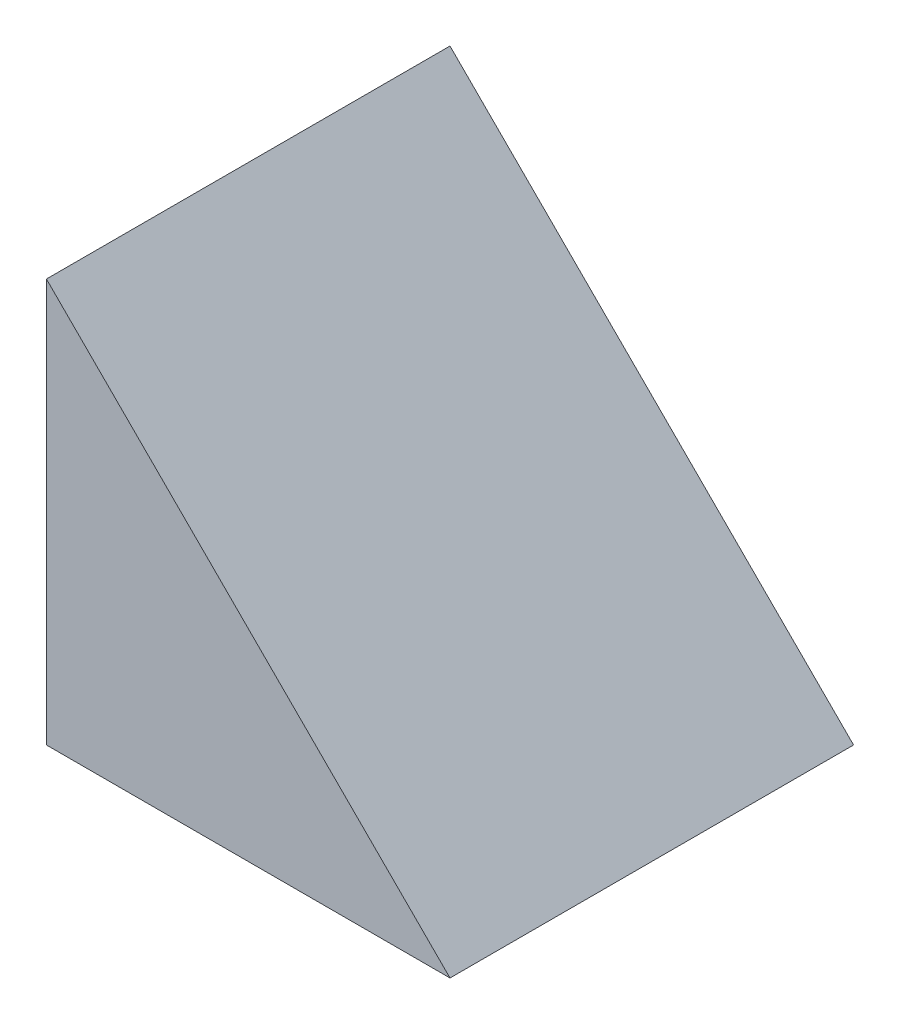
ISO-10303-21;
HEADER;
FILE_DESCRIPTION(('STEP AP214'),'2;1');
FILE_NAME('part.step','',(''),(''),'','','');
FILE_SCHEMA(('AUTOMOTIVE_DESIGN { 1 0 10303 214 1 1 1 1 }'));
ENDSEC;
DATA;
#1=APPLICATION_CONTEXT('core data for automotive mechanical design processes');
#2=APPLICATION_PROTOCOL_DEFINITION('international standard','automotive_design',2000,#1);
#3=PRODUCT_CONTEXT('',#1,'mechanical');
#4=PRODUCT('Part','Part','',(#3));
#5=PRODUCT_RELATED_PRODUCT_CATEGORY('part','',(#4));
#6=PRODUCT_DEFINITION_FORMATION('','',#4);
#7=PRODUCT_DEFINITION_CONTEXT('part definition',#1,'design');
#8=PRODUCT_DEFINITION('design','',#6,#7);
#9=PRODUCT_DEFINITION_SHAPE('','',#8);
#10=(LENGTH_UNIT() NAMED_UNIT(*) SI_UNIT(.MILLI.,.METRE.));
#11=(NAMED_UNIT(*) PLANE_ANGLE_UNIT() SI_UNIT($,.RADIAN.));
#12=(NAMED_UNIT(*) SI_UNIT($,.STERADIAN.) SOLID_ANGLE_UNIT());
#13=UNCERTAINTY_MEASURE_WITH_UNIT(LENGTH_MEASURE(1.E-05),#10,'distance_accuracy_value','');
#14=(GEOMETRIC_REPRESENTATION_CONTEXT(3) GLOBAL_UNCERTAINTY_ASSIGNED_CONTEXT((#13)) GLOBAL_UNIT_ASSIGNED_CONTEXT((#10,
#11,#12)) REPRESENTATION_CONTEXT('',''));
#15=CARTESIAN_POINT('',(0.,0.,0.));
#16=DIRECTION('',(0.,0.,1.));
#17=DIRECTION('',(1.,0.,0.));
#18=AXIS2_PLACEMENT_3D('',#15,#16,#17);
#19=CARTESIAN_POINT('',(30.,0.,30.));
#20=DIRECTION('',(0.,1.,0.));
#21=DIRECTION('',(-1.,0.,0.));
#22=AXIS2_PLACEMENT_3D('',#19,#20,#21);
#23=PLANE('',#22);
#24=DIRECTION('',(1.,0.,0.));
#25=VECTOR('',#24,1.);
#26=CARTESIAN_POINT('',(30.,0.,0.));
#27=LINE('',#26,#25);
#28=CARTESIAN_POINT('',(0.,0.,0.));
#29=VERTEX_POINT('',#28);
#30=CARTESIAN_POINT('',(30.,0.,0.));
#31=VERTEX_POINT('',#30);
#32=EDGE_CURVE('E80',#29,#31,#27,.T.);
#33=ORIENTED_EDGE('',*,*,#32,.T.);
#34=DIRECTION('',(0.,0.,-1.));
#35=VECTOR('',#34,1.);
#36=CARTESIAN_POINT('',(30.,0.,30.));
#37=LINE('',#36,#35);
#38=CARTESIAN_POINT('',(30.,0.,30.));
#39=VERTEX_POINT('',#38);
#40=EDGE_CURVE('E11',#39,#31,#37,.T.);
#41=ORIENTED_EDGE('',*,*,#40,.F.);
#42=DIRECTION('',(1.,0.,0.));
#43=VECTOR('',#42,1.);
#44=CARTESIAN_POINT('',(30.,0.,30.));
#45=LINE('',#44,#43);
#46=CARTESIAN_POINT('',(0.,0.,30.));
#47=VERTEX_POINT('',#46);
#48=EDGE_CURVE('E73',#47,#39,#45,.T.);
#49=ORIENTED_EDGE('',*,*,#48,.F.);
#50=DIRECTION('',(0.,0.,-1.));
#51=VECTOR('',#50,1.);
#52=CARTESIAN_POINT('',(0.,0.,30.));
#53=LINE('',#52,#51);
#54=EDGE_CURVE('E81',#47,#29,#53,.T.);
#55=ORIENTED_EDGE('',*,*,#54,.T.);
#56=EDGE_LOOP('',(#33,#41,#49,#55));
#57=FACE_BOUND('',#56,.T.);
#58=ADVANCED_FACE('F33',(#57),#23,.F.);
#59=CARTESIAN_POINT('',(0.,30.,30.));
#60=DIRECTION('',(-0.707106781186547,-0.707106781186547,0.));
#61=DIRECTION('',(0.707106781186548,-0.707106781186548,0.));
#62=AXIS2_PLACEMENT_3D('',#59,#60,#61);
#63=PLANE('',#62);
#64=DIRECTION('',(-0.707106781186547,0.707106781186547,0.));
#65=VECTOR('',#64,1.);
#66=CARTESIAN_POINT('',(0.,30.,0.));
#67=LINE('',#66,#65);
#68=CARTESIAN_POINT('',(0.,30.,0.));
#69=VERTEX_POINT('',#68);
#70=EDGE_CURVE('E61',#31,#69,#67,.T.);
#71=ORIENTED_EDGE('',*,*,#70,.T.);
#72=DIRECTION('',(0.,0.,-1.));
#73=VECTOR('',#72,1.);
#74=CARTESIAN_POINT('',(0.,30.,30.));
#75=LINE('',#74,#73);
#76=CARTESIAN_POINT('',(0.,30.,30.));
#77=VERTEX_POINT('',#76);
#78=EDGE_CURVE('E41',#77,#69,#75,.T.);
#79=ORIENTED_EDGE('',*,*,#78,.F.);
#80=DIRECTION('',(-0.707106781186547,0.707106781186547,0.));
#81=VECTOR('',#80,1.);
#82=CARTESIAN_POINT('',(0.,30.,30.));
#83=LINE('',#82,#81);
#84=EDGE_CURVE('E69',#39,#77,#83,.T.);
#85=ORIENTED_EDGE('',*,*,#84,.F.);
#86=ORIENTED_EDGE('',*,*,#40,.T.);
#87=EDGE_LOOP('',(#71,#79,#85,#86));
#88=FACE_BOUND('',#87,.T.);
#89=ADVANCED_FACE('F70',(#88),#63,.F.);
#90=CARTESIAN_POINT('',(0.,0.,30.));
#91=DIRECTION('',(1.,0.,0.));
#92=DIRECTION('',(0.,0.,-1.));
#93=AXIS2_PLACEMENT_3D('',#90,#91,#92);
#94=PLANE('',#93);
#95=DIRECTION('',(0.,-1.,0.));
#96=VECTOR('',#95,1.);
#97=CARTESIAN_POINT('',(0.,0.,0.));
#98=LINE('',#97,#96);
#99=EDGE_CURVE('E66',#69,#29,#98,.T.);
#100=ORIENTED_EDGE('',*,*,#99,.T.);
#101=ORIENTED_EDGE('',*,*,#54,.F.);
#102=DIRECTION('',(0.,-1.,0.));
#103=VECTOR('',#102,1.);
#104=CARTESIAN_POINT('',(0.,0.,30.));
#105=LINE('',#104,#103);
#106=EDGE_CURVE('E49',#77,#47,#105,.T.);
#107=ORIENTED_EDGE('',*,*,#106,.F.);
#108=ORIENTED_EDGE('',*,*,#78,.T.);
#109=EDGE_LOOP('',(#100,#101,#107,#108));
#110=FACE_BOUND('',#109,.T.);
#111=ADVANCED_FACE('F88',(#110),#94,.F.);
#112=CARTESIAN_POINT('',(0.,0.,30.));
#113=DIRECTION('',(0.,0.,-1.));
#114=DIRECTION('',(-1.,0.,0.));
#115=AXIS2_PLACEMENT_3D('',#112,#113,#114);
#116=PLANE('',#115);
#117=ORIENTED_EDGE('',*,*,#48,.T.);
#118=ORIENTED_EDGE('',*,*,#84,.T.);
#119=ORIENTED_EDGE('',*,*,#106,.T.);
#120=EDGE_LOOP('',(#117,#118,#119));
#121=FACE_BOUND('',#120,.T.);
#122=ADVANCED_FACE('F76',(#121),#116,.F.);
#123=CARTESIAN_POINT('',(0.,0.,0.));
#124=DIRECTION('',(0.,0.,-1.));
#125=DIRECTION('',(-1.,0.,0.));
#126=AXIS2_PLACEMENT_3D('',#123,#124,#125);
#127=PLANE('',#126);
#128=ORIENTED_EDGE('',*,*,#32,.F.);
#129=ORIENTED_EDGE('',*,*,#99,.F.);
#130=ORIENTED_EDGE('',*,*,#70,.F.);
#131=EDGE_LOOP('',(#128,#129,#130));
#132=FACE_BOUND('',#131,.T.);
#133=ADVANCED_FACE('F89',(#132),#127,.T.);
#134=CLOSED_SHELL('',(#58,#89,#111,#122,#133));
#135=MANIFOLD_SOLID_BREP('B2',#134);
#136=ADVANCED_BREP_SHAPE_REPRESENTATION('',(#18,#135),#14);
#137=SHAPE_DEFINITION_REPRESENTATION(#9,#136);
ENDSEC;
END-ISO-10303-21;
